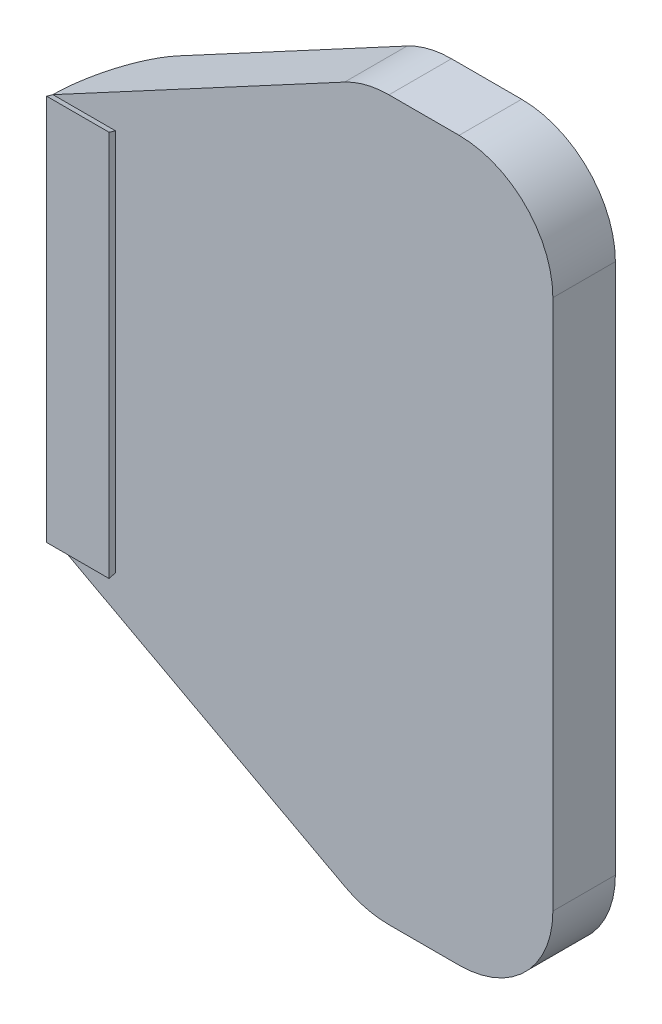
ISO-10303-21;
HEADER;
FILE_DESCRIPTION(('STEP AP214'),'2;1');
FILE_NAME('part.step','',(''),(''),'','','');
FILE_SCHEMA(('AUTOMOTIVE_DESIGN { 1 0 10303 214 1 1 1 1 }'));
ENDSEC;
DATA;
#1=APPLICATION_CONTEXT('core data for automotive mechanical design processes');
#2=APPLICATION_PROTOCOL_DEFINITION('international standard','automotive_design',2000,#1);
#3=PRODUCT_CONTEXT('',#1,'mechanical');
#4=PRODUCT('Part','Part','',(#3));
#5=PRODUCT_RELATED_PRODUCT_CATEGORY('part','',(#4));
#6=PRODUCT_DEFINITION_FORMATION('','',#4);
#7=PRODUCT_DEFINITION_CONTEXT('part definition',#1,'design');
#8=PRODUCT_DEFINITION('design','',#6,#7);
#9=PRODUCT_DEFINITION_SHAPE('','',#8);
#10=(LENGTH_UNIT() NAMED_UNIT(*) SI_UNIT(.MILLI.,.METRE.));
#11=(NAMED_UNIT(*) PLANE_ANGLE_UNIT() SI_UNIT($,.RADIAN.));
#12=(NAMED_UNIT(*) SI_UNIT($,.STERADIAN.) SOLID_ANGLE_UNIT());
#13=UNCERTAINTY_MEASURE_WITH_UNIT(LENGTH_MEASURE(1.E-05),#10,'distance_accuracy_value','');
#14=(GEOMETRIC_REPRESENTATION_CONTEXT(3) GLOBAL_UNCERTAINTY_ASSIGNED_CONTEXT((#13)) GLOBAL_UNIT_ASSIGNED_CONTEXT((#10,
#11,#12)) REPRESENTATION_CONTEXT('',''));
#15=CARTESIAN_POINT('',(0.,0.,0.));
#16=DIRECTION('',(0.,0.,1.));
#17=DIRECTION('',(1.,0.,0.));
#18=AXIS2_PLACEMENT_3D('',#15,#16,#17);
#19=CARTESIAN_POINT('',(-1.890479514298,-0.575,0.1995204857019));
#20=DIRECTION('',(0.,-1.,0.));
#21=DIRECTION('',(0.,0.,-1.));
#22=AXIS2_PLACEMENT_3D('',#19,#20,#21);
#23=PLANE('',#22);
#24=DIRECTION('',(1.,0.,0.));
#25=VECTOR('',#24,1.);
#26=CARTESIAN_POINT('',(-2.012254319843,-0.57500000001,0.09000000001));
#27=LINE('',#26,#25);
#28=CARTESIAN_POINT('',(-2.012254319832,-0.5749999999999,0.09));
#29=VERTEX_POINT('',#28);
#30=CARTESIAN_POINT('',(-1.9,-0.575,0.09));
#31=VERTEX_POINT('',#30);
#32=EDGE_CURVE('E11',#29,#31,#27,.T.);
#33=ORIENTED_EDGE('',*,*,#32,.T.);
#34=DIRECTION('',(0.,0.,1.));
#35=VECTOR('',#34,1.);
#36=CARTESIAN_POINT('',(-1.90000000001,-0.57500000001,0.09000000001));
#37=LINE('',#36,#35);
#38=CARTESIAN_POINT('',(-1.9,-0.575,0.19));
#39=VERTEX_POINT('',#38);
#40=EDGE_CURVE('E24',#31,#39,#37,.T.);
#41=ORIENTED_EDGE('',*,*,#40,.T.);
#42=DIRECTION('',(-1.,0.,0.));
#43=VECTOR('',#42,1.);
#44=CARTESIAN_POINT('',(-1.90000000001,-0.57500000001,0.19000000001));
#45=LINE('',#44,#43);
#46=CARTESIAN_POINT('',(-2.012254319834,-0.575,0.19));
#47=VERTEX_POINT('',#46);
#48=EDGE_CURVE('E224',#39,#47,#45,.T.);
#49=ORIENTED_EDGE('',*,*,#48,.T.);
#50=DIRECTION('',(0.,0.,-1.));
#51=VECTOR('',#50,1.);
#52=CARTESIAN_POINT('',(-2.012254319844,-0.57500000001,0.19000000001));
#53=LINE('',#52,#51);
#54=EDGE_CURVE('E222',#47,#29,#53,.T.);
#55=ORIENTED_EDGE('',*,*,#54,.T.);
#56=EDGE_LOOP('',(#33,#41,#49,#55));
#57=FACE_BOUND('',#56,.T.);
#58=ADVANCED_FACE('F17',(#57),#23,.T.);
#59=CARTESIAN_POINT('',(2.652,0.598,0.19));
#60=DIRECTION('',(0.,0.,-1.));
#61=DIRECTION('',(0.,-1.,0.));
#62=AXIS2_PLACEMENT_3D('',#59,#60,#61);
#63=PLANE('',#62);
#64=DIRECTION('',(-1.,0.,0.));
#65=VECTOR('',#64,1.);
#66=CARTESIAN_POINT('',(-2.45000000001,-0.3063508326996,0.19000000001));
#67=LINE('',#66,#65);
#68=CARTESIAN_POINT('',(-2.45,-0.3063508326896,0.19));
#69=VERTEX_POINT('',#68);
#70=CARTESIAN_POINT('',(-2.55,-0.3063508326896,0.19));
#71=VERTEX_POINT('',#70);
#72=EDGE_CURVE('E220',#69,#71,#67,.T.);
#73=ORIENTED_EDGE('',*,*,#72,.T.);
#74=DIRECTION('',(-0.880898468509068,0.473305280108281,0.));
#75=VECTOR('',#74,1.);
#76=CARTESIAN_POINT('',(-2.08325011186,-0.5571347702871,0.19000000001));
#77=LINE('',#76,#75);
#78=CARTESIAN_POINT('',(-2.083250111849,-0.5571347702774,0.19));
#79=VERTEX_POINT('',#78);
#80=EDGE_CURVE('E217',#79,#71,#77,.T.);
#81=ORIENTED_EDGE('',*,*,#80,.F.);
#82=CARTESIAN_POINT('',(-2.012254319845,-0.42500000001,0.19000000001));
#83=DIRECTION('',(0.,0.,-1.));
#84=DIRECTION('',(0.,-1.,0.));
#85=AXIS2_PLACEMENT_3D('',#82,#83,#84);
#86=CIRCLE('',#85,0.15);
#87=EDGE_CURVE('E214',#47,#79,#86,.T.);
#88=ORIENTED_EDGE('',*,*,#87,.F.);
#89=ORIENTED_EDGE('',*,*,#48,.F.);
#90=CARTESIAN_POINT('',(-1.90000000001,-0.42500000001,0.19000000001));
#91=DIRECTION('',(0.,0.,-1.));
#92=DIRECTION('',(1.,0.,0.));
#93=AXIS2_PLACEMENT_3D('',#90,#91,#92);
#94=CIRCLE('',#93,0.15);
#95=CARTESIAN_POINT('',(-1.75,-0.425,0.19));
#96=VERTEX_POINT('',#95);
#97=EDGE_CURVE('E211',#96,#39,#94,.T.);
#98=ORIENTED_EDGE('',*,*,#97,.F.);
#99=DIRECTION('',(0.,-1.,0.));
#100=VECTOR('',#99,1.);
#101=CARTESIAN_POINT('',(-1.75000000001,0.42500000001,0.19000000001));
#102=LINE('',#101,#100);
#103=CARTESIAN_POINT('',(-1.75,0.425,0.19));
#104=VERTEX_POINT('',#103);
#105=EDGE_CURVE('E208',#104,#96,#102,.T.);
#106=ORIENTED_EDGE('',*,*,#105,.F.);
#107=CARTESIAN_POINT('',(-1.90000000001,0.42500000001,0.19000000001));
#108=DIRECTION('',(0.,0.,-1.));
#109=DIRECTION('',(0.,1.,0.));
#110=AXIS2_PLACEMENT_3D('',#107,#108,#109);
#111=CIRCLE('',#110,0.15);
#112=CARTESIAN_POINT('',(-1.9,0.575,0.19));
#113=VERTEX_POINT('',#112);
#114=EDGE_CURVE('E205',#113,#104,#111,.T.);
#115=ORIENTED_EDGE('',*,*,#114,.F.);
#116=DIRECTION('',(1.,0.,0.));
#117=VECTOR('',#116,1.);
#118=CARTESIAN_POINT('',(-2.012254319845,0.57500000001,0.19000000001));
#119=LINE('',#118,#117);
#120=CARTESIAN_POINT('',(-2.012254319835,0.575,0.19));
#121=VERTEX_POINT('',#120);
#122=EDGE_CURVE('E202',#121,#113,#119,.T.);
#123=ORIENTED_EDGE('',*,*,#122,.F.);
#124=CARTESIAN_POINT('',(-2.012254319845,0.42500000001,0.19000000001));
#125=DIRECTION('',(0.,0.,-1.));
#126=DIRECTION('',(-0.473305280134349,0.880898468495062,0.));
#127=AXIS2_PLACEMENT_3D('',#124,#125,#126);
#128=CIRCLE('',#127,0.15);
#129=CARTESIAN_POINT('',(-2.08325011185,0.5571347702768,0.19));
#130=VERTEX_POINT('',#129);
#131=EDGE_CURVE('E199',#130,#121,#128,.T.);
#132=ORIENTED_EDGE('',*,*,#131,.F.);
#133=DIRECTION('',(0.880898468508962,0.473305280108478,0.));
#134=VECTOR('',#133,1.);
#135=CARTESIAN_POINT('',(-2.55000000001,0.3063508326996,0.19000000001));
#136=LINE('',#135,#134);
#137=CARTESIAN_POINT('',(-2.55,0.3063508326896,0.19));
#138=VERTEX_POINT('',#137);
#139=EDGE_CURVE('E196',#138,#130,#136,.T.);
#140=ORIENTED_EDGE('',*,*,#139,.F.);
#141=DIRECTION('',(1.,0.,0.));
#142=VECTOR('',#141,1.);
#143=CARTESIAN_POINT('',(-2.55000000001,0.3063508326996,0.19000000001));
#144=LINE('',#143,#142);
#145=CARTESIAN_POINT('',(-2.45,0.3063508326896,0.19));
#146=VERTEX_POINT('',#145);
#147=EDGE_CURVE('E194',#138,#146,#144,.T.);
#148=ORIENTED_EDGE('',*,*,#147,.T.);
#149=DIRECTION('',(0.,1.,0.));
#150=VECTOR('',#149,1.);
#151=CARTESIAN_POINT('',(-2.45000000001,-0.3063508326996,0.19000000001));
#152=LINE('',#151,#150);
#153=EDGE_CURVE('E191',#69,#146,#152,.T.);
#154=ORIENTED_EDGE('',*,*,#153,.F.);
#155=EDGE_LOOP('',(#73,#81,#88,#89,#98,#106,#115,#123,#132,#140,#148,#154));
#156=FACE_BOUND('',#155,.T.);
#157=ADVANCED_FACE('F230',(#156),#63,.F.);
#158=CARTESIAN_POINT('',(2.548,-0.598,0.09));
#159=DIRECTION('',(0.,0.,1.));
#160=DIRECTION('',(1.,0.,0.));
#161=AXIS2_PLACEMENT_3D('',#158,#159,#160);
#162=PLANE('',#161);
#163=DIRECTION('',(-1.,0.,0.));
#164=VECTOR('',#163,1.);
#165=CARTESIAN_POINT('',(-1.90000000001,0.57500000001,0.09000000001));
#166=LINE('',#165,#164);
#167=CARTESIAN_POINT('',(-1.9,0.575,0.09));
#168=VERTEX_POINT('',#167);
#169=CARTESIAN_POINT('',(-2.012254319835,0.575,0.09));
#170=VERTEX_POINT('',#169);
#171=EDGE_CURVE('E189',#168,#170,#166,.T.);
#172=ORIENTED_EDGE('',*,*,#171,.F.);
#173=CARTESIAN_POINT('',(-1.90000000001,0.42500000001,0.09000000001));
#174=DIRECTION('',(0.,0.,1.));
#175=DIRECTION('',(1.,0.,0.));
#176=AXIS2_PLACEMENT_3D('',#173,#174,#175);
#177=CIRCLE('',#176,0.15);
#178=CARTESIAN_POINT('',(-1.75,0.425,0.09));
#179=VERTEX_POINT('',#178);
#180=EDGE_CURVE('E186',#179,#168,#177,.T.);
#181=ORIENTED_EDGE('',*,*,#180,.F.);
#182=DIRECTION('',(0.,1.,0.));
#183=VECTOR('',#182,1.);
#184=CARTESIAN_POINT('',(-1.75000000001,-0.42500000001,0.09000000001));
#185=LINE('',#184,#183);
#186=CARTESIAN_POINT('',(-1.75,-0.425,0.09));
#187=VERTEX_POINT('',#186);
#188=EDGE_CURVE('E183',#187,#179,#185,.T.);
#189=ORIENTED_EDGE('',*,*,#188,.F.);
#190=CARTESIAN_POINT('',(-1.90000000001,-0.42500000001,0.09000000001));
#191=DIRECTION('',(0.,0.,1.));
#192=DIRECTION('',(0.,-1.,0.));
#193=AXIS2_PLACEMENT_3D('',#190,#191,#192);
#194=CIRCLE('',#193,0.15);
#195=EDGE_CURVE('E180',#31,#187,#194,.T.);
#196=ORIENTED_EDGE('',*,*,#195,.F.);
#197=ORIENTED_EDGE('',*,*,#32,.F.);
#198=CARTESIAN_POINT('',(-2.012254319845,-0.42500000001,0.09000000001));
#199=DIRECTION('',(0.,0.,1.));
#200=DIRECTION('',(-0.47330528012284,-0.880898468501246,0.));
#201=AXIS2_PLACEMENT_3D('',#198,#199,#200);
#202=CIRCLE('',#201,0.15);
#203=CARTESIAN_POINT('',(-2.08325011185,-0.5571347702769,0.09));
#204=VERTEX_POINT('',#203);
#205=EDGE_CURVE('E177',#204,#29,#202,.T.);
#206=ORIENTED_EDGE('',*,*,#205,.F.);
#207=DIRECTION('',(0.880898468508075,-0.473305280110129,0.));
#208=VECTOR('',#207,1.);
#209=CARTESIAN_POINT('',(-2.45000000001,-0.3600806661617,0.09000000001));
#210=LINE('',#209,#208);
#211=CARTESIAN_POINT('',(-2.45,-0.3600806661517,0.09));
#212=VERTEX_POINT('',#211);
#213=EDGE_CURVE('E174',#212,#204,#210,.T.);
#214=ORIENTED_EDGE('',*,*,#213,.F.);
#215=DIRECTION('',(0.,1.,0.));
#216=VECTOR('',#215,1.);
#217=CARTESIAN_POINT('',(-2.45000000001,-0.3600806661617,0.09000000001));
#218=LINE('',#217,#216);
#219=CARTESIAN_POINT('',(-2.45,0.3600806661517,0.09));
#220=VERTEX_POINT('',#219);
#221=EDGE_CURVE('E172',#212,#220,#218,.T.);
#222=ORIENTED_EDGE('',*,*,#221,.T.);
#223=DIRECTION('',(-0.880898468508034,-0.473305280110206,0.));
#224=VECTOR('',#223,1.);
#225=CARTESIAN_POINT('',(-2.083250111859,0.5571347702874,0.09000000001));
#226=LINE('',#225,#224);
#227=CARTESIAN_POINT('',(-2.083250111849,0.5571347702774,0.09));
#228=VERTEX_POINT('',#227);
#229=EDGE_CURVE('E169',#228,#220,#226,.T.);
#230=ORIENTED_EDGE('',*,*,#229,.F.);
#231=CARTESIAN_POINT('',(-2.012254319845,0.42500000001,0.09000000001));
#232=DIRECTION('',(0.,0.,1.));
#233=DIRECTION('',(0.,1.,0.));
#234=AXIS2_PLACEMENT_3D('',#231,#232,#233);
#235=CIRCLE('',#234,0.15);
#236=EDGE_CURVE('E166',#170,#228,#235,.T.);
#237=ORIENTED_EDGE('',*,*,#236,.F.);
#238=EDGE_LOOP('',(#172,#181,#189,#196,#197,#206,#214,#222,#230,#237));
#239=FACE_BOUND('',#238,.T.);
#240=ADVANCED_FACE('F263',(#239),#162,.F.);
#241=CARTESIAN_POINT('',(-2.012254319835,0.425,0.08047951450862));
#242=DIRECTION('',(0.,0.,-1.));
#243=DIRECTION('',(1.,0.,0.));
#244=AXIS2_PLACEMENT_3D('',#241,#242,#243);
#245=CYLINDRICAL_SURFACE('',#244,0.15);
#246=DIRECTION('',(0.,0.,-1.));
#247=VECTOR('',#246,1.);
#248=CARTESIAN_POINT('',(-2.08325011186,0.5571347702868,0.19000000001));
#249=LINE('',#248,#247);
#250=EDGE_CURVE('E163',#130,#228,#249,.T.);
#251=ORIENTED_EDGE('',*,*,#250,.F.);
#252=ORIENTED_EDGE('',*,*,#131,.T.);
#253=DIRECTION('',(0.,0.,1.));
#254=VECTOR('',#253,1.);
#255=CARTESIAN_POINT('',(-2.012254319845,0.57500000001,0.09000000001));
#256=LINE('',#255,#254);
#257=EDGE_CURVE('E160',#170,#121,#256,.T.);
#258=ORIENTED_EDGE('',*,*,#257,.F.);
#259=ORIENTED_EDGE('',*,*,#236,.T.);
#260=EDGE_LOOP('',(#251,#252,#258,#259));
#261=FACE_BOUND('',#260,.T.);
#262=ADVANCED_FACE('F245',(#261),#245,.T.);
#263=CARTESIAN_POINT('',(-1.9,-0.425,0.08047951450862));
#264=DIRECTION('',(0.,0.,-1.));
#265=DIRECTION('',(1.,0.,0.));
#266=AXIS2_PLACEMENT_3D('',#263,#264,#265);
#267=CYLINDRICAL_SURFACE('',#266,0.15);
#268=DIRECTION('',(0.,0.,-1.));
#269=VECTOR('',#268,1.);
#270=CARTESIAN_POINT('',(-1.75000000001,-0.42500000001,0.19000000001));
#271=LINE('',#270,#269);
#272=EDGE_CURVE('E157',#96,#187,#271,.T.);
#273=ORIENTED_EDGE('',*,*,#272,.F.);
#274=ORIENTED_EDGE('',*,*,#97,.T.);
#275=ORIENTED_EDGE('',*,*,#40,.F.);
#276=ORIENTED_EDGE('',*,*,#195,.T.);
#277=EDGE_LOOP('',(#273,#274,#275,#276));
#278=FACE_BOUND('',#277,.T.);
#279=ADVANCED_FACE('F232',(#278),#267,.T.);
#280=CARTESIAN_POINT('',(-2.45,-1.352,0.179));
#281=DIRECTION('',(1.,0.,0.));
#282=DIRECTION('',(0.,1.,0.));
#283=AXIS2_PLACEMENT_3D('',#280,#281,#282);
#284=PLANE('',#283);
#285=DIRECTION('',(0.,1.,0.));
#286=VECTOR('',#285,1.);
#287=CARTESIAN_POINT('',(-2.45,-0.676,0.2));
#288=LINE('',#287,#286);
#289=CARTESIAN_POINT('',(-2.45000000001,-0.309212159723466,0.2));
#290=VERTEX_POINT('',#289);
#291=CARTESIAN_POINT('',(-2.45000000001,0.309212159723466,0.2));
#292=VERTEX_POINT('',#291);
#293=EDGE_CURVE('E155',#290,#292,#288,.T.);
#294=ORIENTED_EDGE('',*,*,#293,.F.);
#295=CARTESIAN_POINT('',(-2.45000000001,-0.50000000001,0.14000000001));
#296=DIRECTION('',(1.,0.,0.));
#297=DIRECTION('',(0.,0.968245836542849,0.250000000034879));
#298=AXIS2_PLACEMENT_3D('',#295,#296,#297);
#299=CIRCLE('',#298,0.2);
#300=EDGE_CURVE('E130',#69,#290,#299,.T.);
#301=ORIENTED_EDGE('',*,*,#300,.F.);
#302=ORIENTED_EDGE('',*,*,#153,.T.);
#303=CARTESIAN_POINT('',(-2.45000000001,0.50000000001,0.14000000001));
#304=DIRECTION('',(1.,0.,0.));
#305=DIRECTION('',(0.,-0.235889894390546,0.97177978869928));
#306=AXIS2_PLACEMENT_3D('',#303,#304,#305);
#307=CIRCLE('',#306,0.2);
#308=EDGE_CURVE('E151',#292,#146,#307,.T.);
#309=ORIENTED_EDGE('',*,*,#308,.F.);
#310=EDGE_LOOP('',(#294,#301,#302,#309));
#311=FACE_BOUND('',#310,.T.);
#312=ADVANCED_FACE('F306',(#311),#284,.T.);
#313=CARTESIAN_POINT('',(-2.559520485374,0.5,0.14));
#314=DIRECTION('',(-1.,0.,0.));
#315=DIRECTION('',(0.,0.,-1.));
#316=AXIS2_PLACEMENT_3D('',#313,#314,#315);
#317=CYLINDRICAL_SURFACE('',#316,0.2);
#318=DIRECTION('',(-1.,0.,0.));
#319=VECTOR('',#318,1.);
#320=CARTESIAN_POINT('',(-2.559520485374,0.309212159716611,0.2));
#321=LINE('',#320,#319);
#322=CARTESIAN_POINT('',(-2.55000000001,0.309212159723466,0.2));
#323=VERTEX_POINT('',#322);
#324=EDGE_CURVE('E114',#292,#323,#321,.T.);
#325=ORIENTED_EDGE('',*,*,#324,.F.);
#326=ORIENTED_EDGE('',*,*,#308,.T.);
#327=ORIENTED_EDGE('',*,*,#147,.F.);
#328=CARTESIAN_POINT('',(-2.55000000001,0.50000000001,0.14000000001));
#329=DIRECTION('',(-1.,0.,0.));
#330=DIRECTION('',(0.,-0.968245836542903,0.250000000034667));
#331=AXIS2_PLACEMENT_3D('',#328,#329,#330);
#332=CIRCLE('',#331,0.2);
#333=EDGE_CURVE('E148',#138,#323,#332,.T.);
#334=ORIENTED_EDGE('',*,*,#333,.T.);
#335=EDGE_LOOP('',(#325,#326,#327,#334));
#336=FACE_BOUND('',#335,.T.);
#337=ADVANCED_FACE('F252',(#336),#317,.F.);
#338=CARTESIAN_POINT('',(-2.45,0.3744838923012,0.19));
#339=DIRECTION('',(0.,1.,0.));
#340=DIRECTION('',(0.,0.,-1.));
#341=AXIS2_PLACEMENT_3D('',#338,#339,#340);
#342=CYLINDRICAL_SURFACE('',#341,0.1);
#343=ORIENTED_EDGE('',*,*,#221,.F.);
#344=CARTESIAN_POINT('',(-2.45,-0.360080666151657,0.19));
#345=DIRECTION('',(-0.473305280101505,-0.880898468512709,0.));
#346=DIRECTION('',(-0.880898468512709,0.473305280101505,0.));
#347=AXIS2_PLACEMENT_3D('',#344,#345,#346);
#348=ELLIPSE('',#347,0.113520460727827,0.1);
#349=EDGE_CURVE('E145',#71,#212,#348,.T.);
#350=ORIENTED_EDGE('',*,*,#349,.F.);
#351=DIRECTION('',(0.,-1.,0.));
#352=VECTOR('',#351,1.);
#353=CARTESIAN_POINT('',(-2.55000000001,0.3063508326996,0.19000000001));
#354=LINE('',#353,#352);
#355=EDGE_CURVE('E124',#138,#71,#354,.T.);
#356=ORIENTED_EDGE('',*,*,#355,.F.);
#357=CARTESIAN_POINT('',(-2.45,0.360080666151681,0.19));
#358=DIRECTION('',(-0.473305280101505,0.880898468512709,0.));
#359=DIRECTION('',(-0.880898468512709,-0.473305280101505,0.));
#360=AXIS2_PLACEMENT_3D('',#357,#358,#359);
#361=ELLIPSE('',#360,0.113520460727827,0.1);
#362=EDGE_CURVE('E141',#220,#138,#361,.T.);
#363=ORIENTED_EDGE('',*,*,#362,.F.);
#364=EDGE_LOOP('',(#343,#350,#356,#363));
#365=FACE_BOUND('',#364,.T.);
#366=ADVANCED_FACE('F257',(#365),#342,.T.);
#367=CARTESIAN_POINT('',(-2.073915114087,-0.5621504490286,0.1995204857019));
#368=DIRECTION('',(-0.473305280101505,-0.880898468512709,0.));
#369=DIRECTION('',(-0.880898468512709,0.473305280101505,0.));
#370=AXIS2_PLACEMENT_3D('',#367,#368,#369);
#371=PLANE('',#370);
#372=ORIENTED_EDGE('',*,*,#80,.T.);
#373=ORIENTED_EDGE('',*,*,#349,.T.);
#374=ORIENTED_EDGE('',*,*,#213,.T.);
#375=DIRECTION('',(0.,0.,1.));
#376=VECTOR('',#375,1.);
#377=CARTESIAN_POINT('',(-2.08325011186,-0.5571347702869,0.09000000001));
#378=LINE('',#377,#376);
#379=EDGE_CURVE('E138',#204,#79,#378,.T.);
#380=ORIENTED_EDGE('',*,*,#379,.T.);
#381=EDGE_LOOP('',(#372,#373,#374,#380));
#382=FACE_BOUND('',#381,.T.);
#383=ADVANCED_FACE('F259',(#382),#371,.T.);
#384=CARTESIAN_POINT('',(-2.012254319835,-0.425,0.08047951450862));
#385=DIRECTION('',(0.,0.,-1.));
#386=DIRECTION('',(1.,0.,0.));
#387=AXIS2_PLACEMENT_3D('',#384,#385,#386);
#388=CYLINDRICAL_SURFACE('',#387,0.15);
#389=ORIENTED_EDGE('',*,*,#54,.F.);
#390=ORIENTED_EDGE('',*,*,#87,.T.);
#391=ORIENTED_EDGE('',*,*,#379,.F.);
#392=ORIENTED_EDGE('',*,*,#205,.T.);
#393=EDGE_LOOP('',(#389,#390,#391,#392));
#394=FACE_BOUND('',#393,.T.);
#395=ADVANCED_FACE('F262',(#394),#388,.T.);
#396=CARTESIAN_POINT('',(-2.021774805537,0.575,0.1995204857019));
#397=DIRECTION('',(0.,1.,0.));
#398=DIRECTION('',(1.,0.,0.));
#399=AXIS2_PLACEMENT_3D('',#396,#397,#398);
#400=PLANE('',#399);
#401=ORIENTED_EDGE('',*,*,#122,.T.);
#402=DIRECTION('',(0.,0.,-1.));
#403=VECTOR('',#402,1.);
#404=CARTESIAN_POINT('',(-1.90000000001,0.57500000001,0.19000000001));
#405=LINE('',#404,#403);
#406=EDGE_CURVE('E135',#113,#168,#405,.T.);
#407=ORIENTED_EDGE('',*,*,#406,.T.);
#408=ORIENTED_EDGE('',*,*,#171,.T.);
#409=ORIENTED_EDGE('',*,*,#257,.T.);
#410=EDGE_LOOP('',(#401,#407,#408,#409));
#411=FACE_BOUND('',#410,.T.);
#412=ADVANCED_FACE('F240',(#411),#400,.T.);
#413=CARTESIAN_POINT('',(-1.9,0.425,0.08047951450862));
#414=DIRECTION('',(0.,0.,-1.));
#415=DIRECTION('',(1.,0.,0.));
#416=AXIS2_PLACEMENT_3D('',#413,#414,#415);
#417=CYLINDRICAL_SURFACE('',#416,0.15);
#418=ORIENTED_EDGE('',*,*,#406,.F.);
#419=ORIENTED_EDGE('',*,*,#114,.T.);
#420=DIRECTION('',(0.,0.,1.));
#421=VECTOR('',#420,1.);
#422=CARTESIAN_POINT('',(-1.75000000001,0.42500000001,0.09000000001));
#423=LINE('',#422,#421);
#424=EDGE_CURVE('E117',#179,#104,#423,.T.);
#425=ORIENTED_EDGE('',*,*,#424,.F.);
#426=ORIENTED_EDGE('',*,*,#180,.T.);
#427=EDGE_LOOP('',(#418,#419,#425,#426));
#428=FACE_BOUND('',#427,.T.);
#429=ADVANCED_FACE('F238',(#428),#417,.T.);
#430=CARTESIAN_POINT('',(-1.75,0.442,0.1995204857019));
#431=DIRECTION('',(1.,0.,0.));
#432=DIRECTION('',(0.,1.,0.));
#433=AXIS2_PLACEMENT_3D('',#430,#431,#432);
#434=PLANE('',#433);
#435=ORIENTED_EDGE('',*,*,#105,.T.);
#436=ORIENTED_EDGE('',*,*,#272,.T.);
#437=ORIENTED_EDGE('',*,*,#188,.T.);
#438=ORIENTED_EDGE('',*,*,#424,.T.);
#439=EDGE_LOOP('',(#435,#436,#437,#438));
#440=FACE_BOUND('',#439,.T.);
#441=ADVANCED_FACE('F234',(#440),#434,.T.);
#442=CARTESIAN_POINT('',(-2.559334997763,0.3013351539379,0.1995204857019));
#443=DIRECTION('',(-0.473305280101505,0.880898468512709,0.));
#444=DIRECTION('',(0.,0.,1.));
#445=AXIS2_PLACEMENT_3D('',#442,#443,#444);
#446=PLANE('',#445);
#447=ORIENTED_EDGE('',*,*,#229,.T.);
#448=ORIENTED_EDGE('',*,*,#362,.T.);
#449=ORIENTED_EDGE('',*,*,#139,.T.);
#450=ORIENTED_EDGE('',*,*,#250,.T.);
#451=EDGE_LOOP('',(#447,#448,#449,#450));
#452=FACE_BOUND('',#451,.T.);
#453=ADVANCED_FACE('F247',(#452),#446,.T.);
#454=CARTESIAN_POINT('',(-2.55,1.352,0.179));
#455=DIRECTION('',(-1.,0.,0.));
#456=DIRECTION('',(0.,0.,1.));
#457=AXIS2_PLACEMENT_3D('',#454,#455,#456);
#458=PLANE('',#457);
#459=DIRECTION('',(0.,-1.,0.));
#460=VECTOR('',#459,1.);
#461=CARTESIAN_POINT('',(-2.55,0.676,0.2));
#462=LINE('',#461,#460);
#463=CARTESIAN_POINT('',(-2.55000000001,-0.309212159723466,0.2));
#464=VERTEX_POINT('',#463);
#465=EDGE_CURVE('E108',#323,#464,#462,.T.);
#466=ORIENTED_EDGE('',*,*,#465,.F.);
#467=ORIENTED_EDGE('',*,*,#333,.F.);
#468=ORIENTED_EDGE('',*,*,#355,.T.);
#469=CARTESIAN_POINT('',(-2.55000000001,-0.50000000001,0.14000000001));
#470=DIRECTION('',(-1.,0.,0.));
#471=DIRECTION('',(0.,0.235889894391064,0.971779788699154));
#472=AXIS2_PLACEMENT_3D('',#469,#470,#471);
#473=CIRCLE('',#472,0.2);
#474=EDGE_CURVE('E118',#464,#71,#473,.T.);
#475=ORIENTED_EDGE('',*,*,#474,.F.);
#476=EDGE_LOOP('',(#466,#467,#468,#475));
#477=FACE_BOUND('',#476,.T.);
#478=ADVANCED_FACE('F122',(#477),#458,.T.);
#479=CARTESIAN_POINT('',(-2.559520485374,-0.5,0.14));
#480=DIRECTION('',(-1.,0.,0.));
#481=DIRECTION('',(0.,0.,-1.));
#482=AXIS2_PLACEMENT_3D('',#479,#480,#481);
#483=CYLINDRICAL_SURFACE('',#482,0.2);
#484=DIRECTION('',(1.,0.,0.));
#485=VECTOR('',#484,1.);
#486=CARTESIAN_POINT('',(-2.559520485374,-0.309212159716611,0.2));
#487=LINE('',#486,#485);
#488=EDGE_CURVE('E112',#464,#290,#487,.T.);
#489=ORIENTED_EDGE('',*,*,#488,.F.);
#490=ORIENTED_EDGE('',*,*,#474,.T.);
#491=ORIENTED_EDGE('',*,*,#72,.F.);
#492=ORIENTED_EDGE('',*,*,#300,.T.);
#493=EDGE_LOOP('',(#489,#490,#491,#492));
#494=FACE_BOUND('',#493,.T.);
#495=ADVANCED_FACE('F128',(#494),#483,.F.);
#496=CARTESIAN_POINT('',(-0.056829673202751,0.,0.2));
#497=DIRECTION('',(0.,0.,-1.));
#498=DIRECTION('',(-1.,0.,0.));
#499=AXIS2_PLACEMENT_3D('',#496,#497,#498);
#500=PLANE('',#499);
#501=ORIENTED_EDGE('',*,*,#465,.T.);
#502=ORIENTED_EDGE('',*,*,#488,.T.);
#503=ORIENTED_EDGE('',*,*,#293,.T.);
#504=ORIENTED_EDGE('',*,*,#324,.T.);
#505=EDGE_LOOP('',(#501,#502,#503,#504));
#506=FACE_BOUND('',#505,.T.);
#507=ADVANCED_FACE('F110',(#506),#500,.F.);
#508=CLOSED_SHELL('',(#58,#157,#240,#262,#279,#312,#337,#366,#383,#395,#412,#429,#441,#453,#478,
#495,#507));
#509=MANIFOLD_SOLID_BREP('B1',#508);
#510=ADVANCED_BREP_SHAPE_REPRESENTATION('',(#18,#509),#14);
#511=SHAPE_DEFINITION_REPRESENTATION(#9,#510);
ENDSEC;
END-ISO-10303-21;
